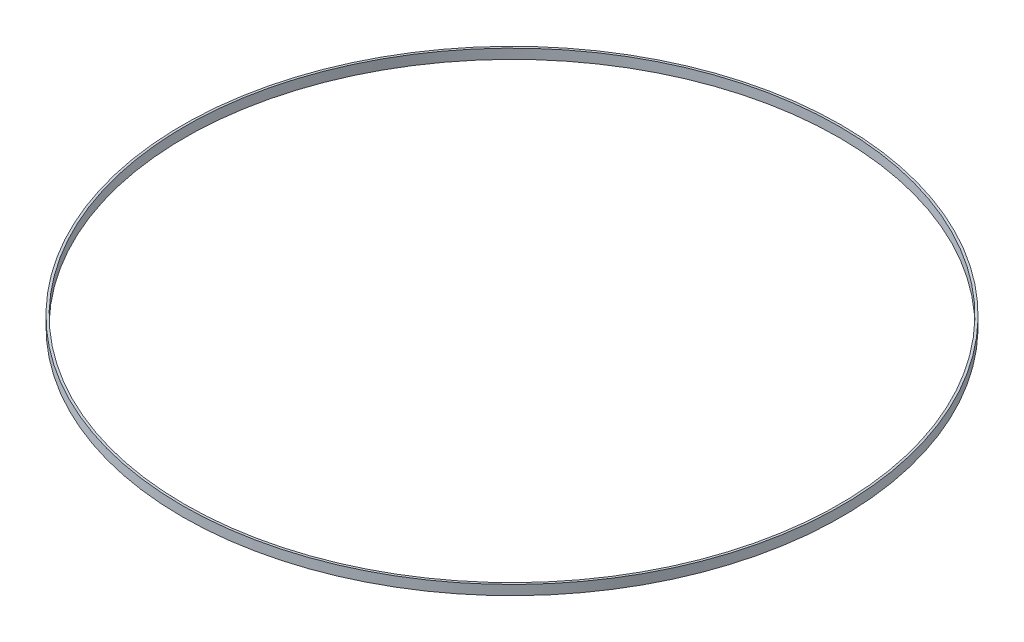
ISO-10303-21;
HEADER;
FILE_DESCRIPTION(('STEP AP214'),'2;1');
FILE_NAME('part.step','',(''),(''),'','','');
FILE_SCHEMA(('AUTOMOTIVE_DESIGN { 1 0 10303 214 1 1 1 1 }'));
ENDSEC;
DATA;
#1=APPLICATION_CONTEXT('core data for automotive mechanical design processes');
#2=APPLICATION_PROTOCOL_DEFINITION('international standard','automotive_design',2000,#1);
#3=PRODUCT_CONTEXT('',#1,'mechanical');
#4=PRODUCT('Part','Part','',(#3));
#5=PRODUCT_RELATED_PRODUCT_CATEGORY('part','',(#4));
#6=PRODUCT_DEFINITION_FORMATION('','',#4);
#7=PRODUCT_DEFINITION_CONTEXT('part definition',#1,'design');
#8=PRODUCT_DEFINITION('design','',#6,#7);
#9=PRODUCT_DEFINITION_SHAPE('','',#8);
#10=(LENGTH_UNIT() NAMED_UNIT(*) SI_UNIT(.MILLI.,.METRE.));
#11=(NAMED_UNIT(*) PLANE_ANGLE_UNIT() SI_UNIT($,.RADIAN.));
#12=(NAMED_UNIT(*) SI_UNIT($,.STERADIAN.) SOLID_ANGLE_UNIT());
#13=UNCERTAINTY_MEASURE_WITH_UNIT(LENGTH_MEASURE(1.E-05),#10,'distance_accuracy_value','');
#14=(GEOMETRIC_REPRESENTATION_CONTEXT(3) GLOBAL_UNCERTAINTY_ASSIGNED_CONTEXT((#13)) GLOBAL_UNIT_ASSIGNED_CONTEXT((#10,
#11,#12)) REPRESENTATION_CONTEXT('',''));
#15=CARTESIAN_POINT('',(0.,0.,0.));
#16=DIRECTION('',(0.,0.,1.));
#17=DIRECTION('',(1.,0.,0.));
#18=AXIS2_PLACEMENT_3D('',#15,#16,#17);
#19=CARTESIAN_POINT('',(0.,13.,0.));
#20=DIRECTION('',(0.,1.,0.));
#21=DIRECTION('',(0.,0.,1.));
#22=AXIS2_PLACEMENT_3D('',#19,#20,#21);
#23=PLANE('',#22);
#24=CARTESIAN_POINT('',(0.,13.,0.));
#25=DIRECTION('',(0.,1.,0.));
#26=DIRECTION('',(0.,0.,1.));
#27=AXIS2_PLACEMENT_3D('',#24,#25,#26);
#28=CIRCLE('',#27,440.);
#29=CARTESIAN_POINT('',(0.,13.,-440.));
#30=VERTEX_POINT('',#29);
#31=EDGE_CURVE('E10',#30,#30,#28,.T.);
#32=ORIENTED_EDGE('',*,*,#31,.T.);
#33=EDGE_LOOP('',(#32));
#34=FACE_BOUND('',#33,.T.);
#35=CARTESIAN_POINT('',(0.,13.,0.));
#36=DIRECTION('',(0.,1.,0.));
#37=DIRECTION('',(0.,0.,1.));
#38=AXIS2_PLACEMENT_3D('',#35,#36,#37);
#39=CIRCLE('',#38,437.);
#40=CARTESIAN_POINT('',(0.,13.,-437.));
#41=VERTEX_POINT('',#40);
#42=EDGE_CURVE('E50',#41,#41,#39,.T.);
#43=ORIENTED_EDGE('',*,*,#42,.F.);
#44=EDGE_LOOP('',(#43));
#45=FACE_BOUND('',#44,.T.);
#46=ADVANCED_FACE('F37',(#34,#45),#23,.T.);
#47=CARTESIAN_POINT('',(0.,0.,0.));
#48=DIRECTION('',(0.,1.,0.));
#49=DIRECTION('',(0.,0.,1.));
#50=AXIS2_PLACEMENT_3D('',#47,#48,#49);
#51=PLANE('',#50);
#52=CARTESIAN_POINT('',(0.,0.,0.));
#53=DIRECTION('',(0.,1.,0.));
#54=DIRECTION('',(0.,0.,1.));
#55=AXIS2_PLACEMENT_3D('',#52,#53,#54);
#56=CIRCLE('',#55,440.);
#57=CARTESIAN_POINT('',(0.,0.,-440.));
#58=VERTEX_POINT('',#57);
#59=EDGE_CURVE('E41',#58,#58,#56,.T.);
#60=ORIENTED_EDGE('',*,*,#59,.F.);
#61=EDGE_LOOP('',(#60));
#62=FACE_BOUND('',#61,.T.);
#63=CARTESIAN_POINT('',(0.,0.,0.));
#64=DIRECTION('',(0.,1.,0.));
#65=DIRECTION('',(0.,0.,1.));
#66=AXIS2_PLACEMENT_3D('',#63,#64,#65);
#67=CIRCLE('',#66,437.);
#68=CARTESIAN_POINT('',(0.,0.,-437.));
#69=VERTEX_POINT('',#68);
#70=EDGE_CURVE('E52',#69,#69,#67,.T.);
#71=ORIENTED_EDGE('',*,*,#70,.T.);
#72=EDGE_LOOP('',(#71));
#73=FACE_BOUND('',#72,.T.);
#74=ADVANCED_FACE('F64',(#62,#73),#51,.F.);
#75=CARTESIAN_POINT('',(0.,13.,0.));
#76=DIRECTION('',(0.,-1.,0.));
#77=DIRECTION('',(0.,0.,-1.));
#78=AXIS2_PLACEMENT_3D('',#75,#76,#77);
#79=CYLINDRICAL_SURFACE('',#78,440.);
#80=CARTESIAN_POINT('',(0.,13.,-440.));
#81=CARTESIAN_POINT('',(0.,12.8645833333333,-440.));
#82=CARTESIAN_POINT('',(0.,12.7291666666667,-440.));
#83=CARTESIAN_POINT('',(0.,12.4583333333333,-440.));
#84=CARTESIAN_POINT('',(0.,12.3229166666667,-440.));
#85=CARTESIAN_POINT('',(0.,12.0520833333333,-440.));
#86=CARTESIAN_POINT('',(0.,11.9166666666667,-440.));
#87=CARTESIAN_POINT('',(0.,11.6458333333333,-440.));
#88=CARTESIAN_POINT('',(0.,11.5104166666667,-440.));
#89=CARTESIAN_POINT('',(0.,11.2395833333333,-440.));
#90=CARTESIAN_POINT('',(0.,11.1041666666667,-440.));
#91=CARTESIAN_POINT('',(0.,10.8333333333333,-440.));
#92=CARTESIAN_POINT('',(0.,10.6979166666667,-440.));
#93=CARTESIAN_POINT('',(0.,10.4270833333333,-440.));
#94=CARTESIAN_POINT('',(0.,10.2916666666667,-440.));
#95=CARTESIAN_POINT('',(0.,10.0208333333333,-440.));
#96=CARTESIAN_POINT('',(0.,9.88541666666667,-440.));
#97=CARTESIAN_POINT('',(0.,9.61458333333333,-440.));
#98=CARTESIAN_POINT('',(0.,9.47916666666667,-440.));
#99=CARTESIAN_POINT('',(0.,9.20833333333333,-440.));
#100=CARTESIAN_POINT('',(0.,9.07291666666667,-440.));
#101=CARTESIAN_POINT('',(0.,8.80208333333333,-440.));
#102=CARTESIAN_POINT('',(0.,8.66666666666667,-440.));
#103=CARTESIAN_POINT('',(0.,8.39583333333333,-440.));
#104=CARTESIAN_POINT('',(0.,8.26041666666667,-440.));
#105=CARTESIAN_POINT('',(0.,7.98958333333333,-440.));
#106=CARTESIAN_POINT('',(0.,7.85416666666667,-440.));
#107=CARTESIAN_POINT('',(0.,7.58333333333333,-440.));
#108=CARTESIAN_POINT('',(0.,7.44791666666667,-440.));
#109=CARTESIAN_POINT('',(0.,7.17708333333333,-440.));
#110=CARTESIAN_POINT('',(0.,7.04166666666667,-440.));
#111=CARTESIAN_POINT('',(0.,6.77083333333333,-440.));
#112=CARTESIAN_POINT('',(0.,6.63541666666667,-440.));
#113=CARTESIAN_POINT('',(0.,6.36458333333333,-440.));
#114=CARTESIAN_POINT('',(0.,6.22916666666667,-440.));
#115=CARTESIAN_POINT('',(0.,5.95833333333333,-440.));
#116=CARTESIAN_POINT('',(0.,5.82291666666667,-440.));
#117=CARTESIAN_POINT('',(0.,5.55208333333333,-440.));
#118=CARTESIAN_POINT('',(0.,5.41666666666667,-440.));
#119=CARTESIAN_POINT('',(0.,5.14583333333333,-440.));
#120=CARTESIAN_POINT('',(0.,5.01041666666667,-440.));
#121=CARTESIAN_POINT('',(0.,4.73958333333333,-440.));
#122=CARTESIAN_POINT('',(0.,4.60416666666667,-440.));
#123=CARTESIAN_POINT('',(0.,4.33333333333333,-440.));
#124=CARTESIAN_POINT('',(0.,4.19791666666667,-440.));
#125=CARTESIAN_POINT('',(0.,3.92708333333333,-440.));
#126=CARTESIAN_POINT('',(0.,3.79166666666667,-440.));
#127=CARTESIAN_POINT('',(0.,3.52083333333333,-440.));
#128=CARTESIAN_POINT('',(0.,3.38541666666667,-440.));
#129=CARTESIAN_POINT('',(0.,3.11458333333333,-440.));
#130=CARTESIAN_POINT('',(0.,2.97916666666667,-440.));
#131=CARTESIAN_POINT('',(0.,2.70833333333333,-440.));
#132=CARTESIAN_POINT('',(0.,2.57291666666667,-440.));
#133=CARTESIAN_POINT('',(0.,2.30208333333333,-440.));
#134=CARTESIAN_POINT('',(0.,2.16666666666667,-440.));
#135=CARTESIAN_POINT('',(0.,1.89583333333333,-440.));
#136=CARTESIAN_POINT('',(0.,1.76041666666667,-440.));
#137=CARTESIAN_POINT('',(0.,1.48958333333333,-440.));
#138=CARTESIAN_POINT('',(0.,1.35416666666667,-440.));
#139=CARTESIAN_POINT('',(0.,1.08333333333333,-440.));
#140=CARTESIAN_POINT('',(0.,0.947916666666667,-440.));
#141=CARTESIAN_POINT('',(0.,0.677083333333334,-440.));
#142=CARTESIAN_POINT('',(0.,0.541666666666667,-440.));
#143=CARTESIAN_POINT('',(0.,0.270833333333334,-440.));
#144=CARTESIAN_POINT('',(0.,0.135416666666667,-440.));
#145=CARTESIAN_POINT('',(0.,0.,-440.));
#146=B_SPLINE_CURVE_WITH_KNOTS('',3,(#80,#81,#82,#83,#84,#85,#86,#87,#88,#89,#90,#91,#92,#93,
#94,#95,#96,#97,#98,#99,#100,#101,#102,#103,#104,#105,#106,#107,#108,#109,#110,#111,#112,#113,
#114,#115,#116,#117,#118,#119,#120,#121,#122,#123,#124,#125,#126,#127,#128,#129,#130,#131,#132,
#133,#134,#135,#136,#137,#138,#139,#140,#141,#142,#143,#144,#145),.UNSPECIFIED.,.F.,.F.,(4,2,2,
2,2,2,2,2,2,2,2,2,2,2,2,2,2,2,2,2,2,2,2,2,2,2,2,2,2,2,2,2,4),(0.,0.406249999999999,
0.812499999999999,1.21875,1.625,2.03125,2.4375,2.84375,3.25,3.65625,4.0625,4.46875,4.875,
5.28125,5.6875,6.09375,6.5,6.90625,7.3125,7.71875,8.125,8.53125,8.9375,9.34375,9.75,10.15625,
10.5625,10.96875,11.375,11.78125,12.1875,12.59375,13.),.UNSPECIFIED.);
#147=EDGE_CURVE('BSEAM39',#30,#58,#146,.T.);
#148=ORIENTED_EDGE('',*,*,#31,.F.);
#149=ORIENTED_EDGE('',*,*,#59,.T.);
#150=ORIENTED_EDGE('',*,*,#147,.T.);
#151=ORIENTED_EDGE('',*,*,#147,.F.);
#152=EDGE_LOOP('',(#148,#150,#149,#151));
#153=FACE_BOUND('',#152,.T.);
#154=ADVANCED_FACE('F39',(#153),#79,.T.);
#155=CARTESIAN_POINT('',(0.,13.,0.));
#156=DIRECTION('',(0.,-1.,0.));
#157=DIRECTION('',(0.,0.,-1.));
#158=AXIS2_PLACEMENT_3D('',#155,#156,#157);
#159=CYLINDRICAL_SURFACE('',#158,437.);
#160=CARTESIAN_POINT('',(0.,13.,-437.));
#161=CARTESIAN_POINT('',(0.,12.8645833333333,-437.));
#162=CARTESIAN_POINT('',(0.,12.7291666666667,-437.));
#163=CARTESIAN_POINT('',(0.,12.4583333333333,-437.));
#164=CARTESIAN_POINT('',(0.,12.3229166666667,-437.));
#165=CARTESIAN_POINT('',(0.,12.0520833333333,-437.));
#166=CARTESIAN_POINT('',(0.,11.9166666666667,-437.));
#167=CARTESIAN_POINT('',(0.,11.6458333333333,-437.));
#168=CARTESIAN_POINT('',(0.,11.5104166666667,-437.));
#169=CARTESIAN_POINT('',(0.,11.2395833333333,-437.));
#170=CARTESIAN_POINT('',(0.,11.1041666666667,-437.));
#171=CARTESIAN_POINT('',(0.,10.8333333333333,-437.));
#172=CARTESIAN_POINT('',(0.,10.6979166666667,-437.));
#173=CARTESIAN_POINT('',(0.,10.4270833333333,-437.));
#174=CARTESIAN_POINT('',(0.,10.2916666666667,-437.));
#175=CARTESIAN_POINT('',(0.,10.0208333333333,-437.));
#176=CARTESIAN_POINT('',(0.,9.88541666666667,-437.));
#177=CARTESIAN_POINT('',(0.,9.61458333333333,-437.));
#178=CARTESIAN_POINT('',(0.,9.47916666666667,-437.));
#179=CARTESIAN_POINT('',(0.,9.20833333333333,-437.));
#180=CARTESIAN_POINT('',(0.,9.07291666666666,-437.));
#181=CARTESIAN_POINT('',(0.,8.80208333333333,-437.));
#182=CARTESIAN_POINT('',(0.,8.66666666666667,-437.));
#183=CARTESIAN_POINT('',(0.,8.39583333333333,-437.));
#184=CARTESIAN_POINT('',(0.,8.26041666666667,-437.));
#185=CARTESIAN_POINT('',(0.,7.98958333333333,-437.));
#186=CARTESIAN_POINT('',(0.,7.85416666666667,-437.));
#187=CARTESIAN_POINT('',(0.,7.58333333333333,-437.));
#188=CARTESIAN_POINT('',(0.,7.44791666666667,-437.));
#189=CARTESIAN_POINT('',(0.,7.17708333333333,-437.));
#190=CARTESIAN_POINT('',(0.,7.04166666666667,-437.));
#191=CARTESIAN_POINT('',(0.,6.77083333333333,-437.));
#192=CARTESIAN_POINT('',(0.,6.63541666666667,-437.));
#193=CARTESIAN_POINT('',(0.,6.36458333333333,-437.));
#194=CARTESIAN_POINT('',(0.,6.22916666666667,-437.));
#195=CARTESIAN_POINT('',(0.,5.95833333333333,-437.));
#196=CARTESIAN_POINT('',(0.,5.82291666666667,-437.));
#197=CARTESIAN_POINT('',(0.,5.55208333333333,-437.));
#198=CARTESIAN_POINT('',(0.,5.41666666666667,-437.));
#199=CARTESIAN_POINT('',(0.,5.14583333333333,-437.));
#200=CARTESIAN_POINT('',(0.,5.01041666666667,-437.));
#201=CARTESIAN_POINT('',(0.,4.73958333333333,-437.));
#202=CARTESIAN_POINT('',(0.,4.60416666666667,-437.));
#203=CARTESIAN_POINT('',(0.,4.33333333333333,-437.));
#204=CARTESIAN_POINT('',(0.,4.19791666666667,-437.));
#205=CARTESIAN_POINT('',(0.,3.92708333333333,-437.));
#206=CARTESIAN_POINT('',(0.,3.79166666666667,-437.));
#207=CARTESIAN_POINT('',(0.,3.52083333333333,-437.));
#208=CARTESIAN_POINT('',(0.,3.38541666666667,-437.));
#209=CARTESIAN_POINT('',(0.,3.11458333333333,-437.));
#210=CARTESIAN_POINT('',(0.,2.97916666666667,-437.));
#211=CARTESIAN_POINT('',(0.,2.70833333333333,-437.));
#212=CARTESIAN_POINT('',(0.,2.57291666666667,-437.));
#213=CARTESIAN_POINT('',(0.,2.30208333333333,-437.));
#214=CARTESIAN_POINT('',(0.,2.16666666666667,-437.));
#215=CARTESIAN_POINT('',(0.,1.89583333333333,-437.));
#216=CARTESIAN_POINT('',(0.,1.76041666666667,-437.));
#217=CARTESIAN_POINT('',(0.,1.48958333333333,-437.));
#218=CARTESIAN_POINT('',(0.,1.35416666666667,-437.));
#219=CARTESIAN_POINT('',(0.,1.08333333333333,-437.));
#220=CARTESIAN_POINT('',(0.,0.947916666666667,-437.));
#221=CARTESIAN_POINT('',(0.,0.677083333333334,-437.));
#222=CARTESIAN_POINT('',(0.,0.541666666666667,-437.));
#223=CARTESIAN_POINT('',(0.,0.270833333333334,-437.));
#224=CARTESIAN_POINT('',(0.,0.135416666666667,-437.));
#225=CARTESIAN_POINT('',(0.,0.,-437.));
#226=B_SPLINE_CURVE_WITH_KNOTS('',3,(#160,#161,#162,#163,#164,#165,#166,#167,#168,#169,#170,
#171,#172,#173,#174,#175,#176,#177,#178,#179,#180,#181,#182,#183,#184,#185,#186,#187,#188,#189,
#190,#191,#192,#193,#194,#195,#196,#197,#198,#199,#200,#201,#202,#203,#204,#205,#206,#207,#208,
#209,#210,#211,#212,#213,#214,#215,#216,#217,#218,#219,#220,#221,#222,#223,#224,#225),
.UNSPECIFIED.,.F.,.F.,(4,2,2,2,2,2,2,2,2,2,2,2,2,2,2,2,2,2,2,2,2,2,2,2,2,2,2,2,2,2,2,2,4),(0.,
0.40625,0.812500000000001,1.21875,1.625,2.03125,2.4375,2.84375,3.25,3.65625,4.0625,4.46875,
4.875,5.28125,5.6875,6.09375,6.5,6.90625,7.3125,7.71875,8.125,8.53125,8.9375,9.34375,9.75,
10.15625,10.5625,10.96875,11.375,11.78125,12.1875,12.59375,13.),.UNSPECIFIED.);
#227=EDGE_CURVE('BSEAM60',#41,#69,#226,.T.);
#228=ORIENTED_EDGE('',*,*,#42,.T.);
#229=ORIENTED_EDGE('',*,*,#70,.F.);
#230=ORIENTED_EDGE('',*,*,#227,.T.);
#231=ORIENTED_EDGE('',*,*,#227,.F.);
#232=EDGE_LOOP('',(#228,#230,#229,#231));
#233=FACE_BOUND('',#232,.T.);
#234=ADVANCED_FACE('F60',(#233),#159,.F.);
#235=CLOSED_SHELL('',(#46,#74,#154,#234));
#236=MANIFOLD_SOLID_BREP('B2',#235);
#237=ADVANCED_BREP_SHAPE_REPRESENTATION('',(#18,#236),#14);
#238=SHAPE_DEFINITION_REPRESENTATION(#9,#237);
ENDSEC;
END-ISO-10303-21;
